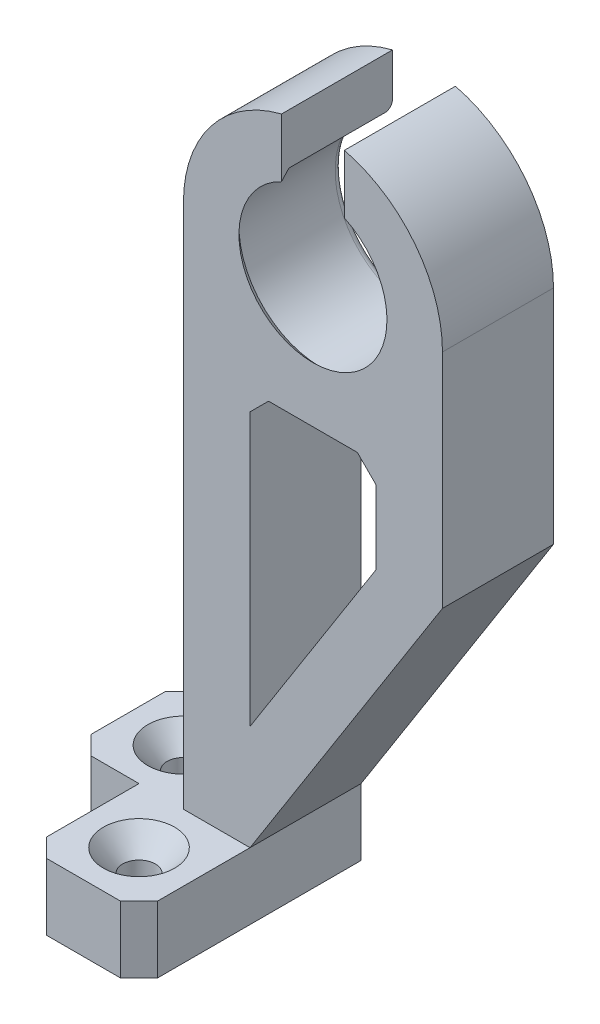
ISO-10303-21;
HEADER;
FILE_DESCRIPTION(('STEP AP214'),'2;1');
FILE_NAME('part.step','',(''),(''),'','','');
FILE_SCHEMA(('AUTOMOTIVE_DESIGN { 1 0 10303 214 1 1 1 1 }'));
ENDSEC;
DATA;
#1=APPLICATION_CONTEXT('core data for automotive mechanical design processes');
#2=APPLICATION_PROTOCOL_DEFINITION('international standard','automotive_design',2000,#1);
#3=PRODUCT_CONTEXT('',#1,'mechanical');
#4=PRODUCT('Part','Part','',(#3));
#5=PRODUCT_RELATED_PRODUCT_CATEGORY('part','',(#4));
#6=PRODUCT_DEFINITION_FORMATION('','',#4);
#7=PRODUCT_DEFINITION_CONTEXT('part definition',#1,'design');
#8=PRODUCT_DEFINITION('design','',#6,#7);
#9=PRODUCT_DEFINITION_SHAPE('','',#8);
#10=(LENGTH_UNIT() NAMED_UNIT(*) SI_UNIT(.MILLI.,.METRE.));
#11=(NAMED_UNIT(*) PLANE_ANGLE_UNIT() SI_UNIT($,.RADIAN.));
#12=(NAMED_UNIT(*) SI_UNIT($,.STERADIAN.) SOLID_ANGLE_UNIT());
#13=UNCERTAINTY_MEASURE_WITH_UNIT(LENGTH_MEASURE(1.E-05),#10,'distance_accuracy_value','');
#14=(GEOMETRIC_REPRESENTATION_CONTEXT(3) GLOBAL_UNCERTAINTY_ASSIGNED_CONTEXT((#13)) GLOBAL_UNIT_ASSIGNED_CONTEXT((#10,
#11,#12)) REPRESENTATION_CONTEXT('',''));
#15=CARTESIAN_POINT('',(0.,0.,0.));
#16=DIRECTION('',(0.,0.,1.));
#17=DIRECTION('',(1.,0.,0.));
#18=AXIS2_PLACEMENT_3D('',#15,#16,#17);
#19=CARTESIAN_POINT('',(0.,0.,15.));
#20=DIRECTION('',(0.,0.,1.));
#21=DIRECTION('',(1.,0.,0.));
#22=AXIS2_PLACEMENT_3D('',#19,#20,#21);
#23=PLANE('',#22);
#24=DIRECTION('',(-1.,0.,0.));
#25=VECTOR('',#24,1.);
#26=CARTESIAN_POINT('',(0.,-71.,15.));
#27=LINE('',#26,#25);
#28=CARTESIAN_POINT('',(-23.5,-71.,15.));
#29=VERTEX_POINT('',#28);
#30=CARTESIAN_POINT('',(-30.,-71.,15.));
#31=VERTEX_POINT('',#30);
#32=EDGE_CURVE('E241',#29,#31,#27,.T.);
#33=ORIENTED_EDGE('',*,*,#32,.T.);
#34=DIRECTION('',(0.,-1.,0.));
#35=VECTOR('',#34,1.);
#36=CARTESIAN_POINT('',(-30.,0.,15.));
#37=LINE('',#36,#35);
#38=CARTESIAN_POINT('',(-30.,-80.,15.));
#39=VERTEX_POINT('',#38);
#40=EDGE_CURVE('E484',#31,#39,#37,.T.);
#41=ORIENTED_EDGE('',*,*,#40,.T.);
#42=DIRECTION('',(1.,0.,0.));
#43=VECTOR('',#42,1.);
#44=CARTESIAN_POINT('',(0.,-80.,15.));
#45=LINE('',#44,#43);
#46=CARTESIAN_POINT('',(-23.5,-80.,15.));
#47=VERTEX_POINT('',#46);
#48=EDGE_CURVE('E247',#39,#47,#45,.T.);
#49=ORIENTED_EDGE('',*,*,#48,.T.);
#50=DIRECTION('',(0.,-1.,0.));
#51=VECTOR('',#50,1.);
#52=CARTESIAN_POINT('',(-23.5,-71.,15.));
#53=LINE('',#52,#51);
#54=EDGE_CURVE('E232',#29,#47,#53,.T.);
#55=ORIENTED_EDGE('',*,*,#54,.F.);
#56=EDGE_LOOP('',(#33,#41,#49,#55));
#57=FACE_BOUND('',#56,.T.);
#58=ADVANCED_FACE('F42',(#57),#23,.T.);
#59=CARTESIAN_POINT('',(0.,0.,15.));
#60=DIRECTION('',(0.,0.,-1.));
#61=DIRECTION('',(-1.,0.,0.));
#62=AXIS2_PLACEMENT_3D('',#59,#60,#61);
#63=CYLINDRICAL_SURFACE('',#62,11.);
#64=DIRECTION('',(0.,0.,-1.));
#65=VECTOR('',#64,1.);
#66=CARTESIAN_POINT('',(4.25,10.1458119438515,15.));
#67=LINE('',#66,#65);
#68=CARTESIAN_POINT('',(4.25,10.1458119438515,14.));
#69=VERTEX_POINT('',#68);
#70=CARTESIAN_POINT('',(4.25,10.1458119438515,1.));
#71=VERTEX_POINT('',#70);
#72=EDGE_CURVE('E362',#69,#71,#67,.T.);
#73=ORIENTED_EDGE('',*,*,#72,.T.);
#74=CARTESIAN_POINT('',(0.,0.,1.));
#75=DIRECTION('',(0.,0.,1.));
#76=DIRECTION('',(1.,0.,0.));
#77=AXIS2_PLACEMENT_3D('',#74,#75,#76);
#78=CIRCLE('',#77,11.);
#79=CARTESIAN_POINT('',(-4.25,10.1458119438515,1.));
#80=VERTEX_POINT('',#79);
#81=EDGE_CURVE('E381',#71,#80,#78,.F.);
#82=ORIENTED_EDGE('',*,*,#81,.T.);
#83=DIRECTION('',(0.,0.,-1.));
#84=VECTOR('',#83,1.);
#85=CARTESIAN_POINT('',(-4.25,10.1458119438515,15.));
#86=LINE('',#85,#84);
#87=CARTESIAN_POINT('',(-4.25,10.1458119438515,14.));
#88=VERTEX_POINT('',#87);
#89=EDGE_CURVE('E359',#88,#80,#86,.T.);
#90=ORIENTED_EDGE('',*,*,#89,.F.);
#91=CARTESIAN_POINT('',(0.,0.,14.));
#92=DIRECTION('',(0.,0.,1.));
#93=DIRECTION('',(1.,0.,0.));
#94=AXIS2_PLACEMENT_3D('',#91,#92,#93);
#95=CIRCLE('',#94,11.);
#96=EDGE_CURVE('E268',#69,#88,#95,.F.);
#97=ORIENTED_EDGE('',*,*,#96,.F.);
#98=EDGE_LOOP('',(#73,#82,#90,#97));
#99=FACE_BOUND('',#98,.T.);
#100=ADVANCED_FACE('F395',(#99),#63,.F.);
#101=CARTESIAN_POINT('',(0.,-17.5,15.));
#102=DIRECTION('',(0.,1.,0.));
#103=DIRECTION('',(0.,0.,1.));
#104=AXIS2_PLACEMENT_3D('',#101,#102,#103);
#105=PLANE('',#104);
#106=DIRECTION('',(1.,0.,0.));
#107=VECTOR('',#106,1.);
#108=CARTESIAN_POINT('',(0.,-17.5,0.));
#109=LINE('',#108,#107);
#110=CARTESIAN_POINT('',(-5.99999999999998,-17.5,0.));
#111=VERTEX_POINT('',#110);
#112=CARTESIAN_POINT('',(6.00000000000002,-17.5,0.));
#113=VERTEX_POINT('',#112);
#114=EDGE_CURVE('E328',#111,#113,#109,.T.);
#115=ORIENTED_EDGE('',*,*,#114,.T.);
#116=DIRECTION('',(0.,0.,1.));
#117=VECTOR('',#116,1.);
#118=CARTESIAN_POINT('',(6.00000000000002,-17.5,15.));
#119=LINE('',#118,#117);
#120=CARTESIAN_POINT('',(6.00000000000002,-17.5,15.));
#121=VERTEX_POINT('',#120);
#122=EDGE_CURVE('E72',#113,#121,#119,.T.);
#123=ORIENTED_EDGE('',*,*,#122,.T.);
#124=DIRECTION('',(1.,0.,0.));
#125=VECTOR('',#124,1.);
#126=CARTESIAN_POINT('',(0.,-17.5,15.));
#127=LINE('',#126,#125);
#128=CARTESIAN_POINT('',(-5.99999999999998,-17.5,15.));
#129=VERTEX_POINT('',#128);
#130=EDGE_CURVE('E292',#129,#121,#127,.T.);
#131=ORIENTED_EDGE('',*,*,#130,.F.);
#132=DIRECTION('',(0.,0.,-1.));
#133=VECTOR('',#132,1.);
#134=CARTESIAN_POINT('',(-5.99999999999998,-17.5,15.));
#135=LINE('',#134,#133);
#136=EDGE_CURVE('E449',#129,#111,#135,.T.);
#137=ORIENTED_EDGE('',*,*,#136,.T.);
#138=EDGE_LOOP('',(#115,#123,#131,#137));
#139=FACE_BOUND('',#138,.T.);
#140=ADVANCED_FACE('F421',(#139),#105,.F.);
#141=CARTESIAN_POINT('',(8.5,0.,15.));
#142=DIRECTION('',(1.,0.,0.));
#143=DIRECTION('',(0.,1.,0.));
#144=AXIS2_PLACEMENT_3D('',#141,#142,#143);
#145=PLANE('',#144);
#146=DIRECTION('',(0.,-1.,0.));
#147=VECTOR('',#146,1.);
#148=CARTESIAN_POINT('',(8.5,0.,15.));
#149=LINE('',#148,#147);
#150=CARTESIAN_POINT('',(8.5,-20.,15.));
#151=VERTEX_POINT('',#150);
#152=CARTESIAN_POINT('',(8.50000000000001,-30.,15.));
#153=VERTEX_POINT('',#152);
#154=EDGE_CURVE('E298',#151,#153,#149,.T.);
#155=ORIENTED_EDGE('',*,*,#154,.F.);
#156=DIRECTION('',(0.,0.,-1.));
#157=VECTOR('',#156,1.);
#158=CARTESIAN_POINT('',(8.5,-20.,0.));
#159=LINE('',#158,#157);
#160=CARTESIAN_POINT('',(8.5,-20.,0.));
#161=VERTEX_POINT('',#160);
#162=EDGE_CURVE('E506',#151,#161,#159,.T.);
#163=ORIENTED_EDGE('',*,*,#162,.T.);
#164=DIRECTION('',(0.,-1.,0.));
#165=VECTOR('',#164,1.);
#166=CARTESIAN_POINT('',(8.5,0.,0.));
#167=LINE('',#166,#165);
#168=CARTESIAN_POINT('',(8.50000000000001,-30.,0.));
#169=VERTEX_POINT('',#168);
#170=EDGE_CURVE('E330',#161,#169,#167,.T.);
#171=ORIENTED_EDGE('',*,*,#170,.T.);
#172=DIRECTION('',(0.,0.,-1.));
#173=VECTOR('',#172,1.);
#174=CARTESIAN_POINT('',(8.50000000000001,-30.,15.));
#175=LINE('',#174,#173);
#176=EDGE_CURVE('E338',#153,#169,#175,.T.);
#177=ORIENTED_EDGE('',*,*,#176,.F.);
#178=EDGE_LOOP('',(#155,#163,#171,#177));
#179=FACE_BOUND('',#178,.T.);
#180=ADVANCED_FACE('F411',(#179),#145,.F.);
#181=CARTESIAN_POINT('',(19.6302503182011,-12.4484514212983,15.));
#182=DIRECTION('',(0.844508578449678,-0.535542025358332,0.));
#183=DIRECTION('',(0.535542025358332,0.844508578449678,0.));
#184=AXIS2_PLACEMENT_3D('',#181,#182,#183);
#185=PLANE('',#184);
#186=DIRECTION('',(-0.535542025358332,-0.844508578449678,0.));
#187=VECTOR('',#186,1.);
#188=CARTESIAN_POINT('',(19.6302503182011,-12.4484514212983,0.));
#189=LINE('',#188,#187);
#190=CARTESIAN_POINT('',(-8.5,-56.8076923076923,0.));
#191=VERTEX_POINT('',#190);
#192=EDGE_CURVE('E332',#169,#191,#189,.T.);
#193=ORIENTED_EDGE('',*,*,#192,.T.);
#194=DIRECTION('',(0.,0.,-1.));
#195=VECTOR('',#194,1.);
#196=CARTESIAN_POINT('',(-8.5,-56.8076923076923,15.));
#197=LINE('',#196,#195);
#198=CARTESIAN_POINT('',(-8.5,-56.8076923076923,15.));
#199=VERTEX_POINT('',#198);
#200=EDGE_CURVE('E335',#199,#191,#197,.T.);
#201=ORIENTED_EDGE('',*,*,#200,.F.);
#202=DIRECTION('',(-0.535542025358332,-0.844508578449678,0.));
#203=VECTOR('',#202,1.);
#204=CARTESIAN_POINT('',(19.6302503182011,-12.4484514212983,15.));
#205=LINE('',#204,#203);
#206=EDGE_CURVE('E296',#153,#199,#205,.T.);
#207=ORIENTED_EDGE('',*,*,#206,.F.);
#208=ORIENTED_EDGE('',*,*,#176,.T.);
#209=EDGE_LOOP('',(#193,#201,#207,#208));
#210=FACE_BOUND('',#209,.T.);
#211=ADVANCED_FACE('F406',(#210),#185,.F.);
#212=CARTESIAN_POINT('',(26.049002969877,-16.5188799321171,15.));
#213=DIRECTION('',(0.844508578449678,-0.535542025358332,0.));
#214=DIRECTION('',(0.535542025358332,0.844508578449678,0.));
#215=AXIS2_PLACEMENT_3D('',#212,#213,#214);
#216=PLANE('',#215);
#217=DIRECTION('',(-0.535542025358332,-0.844508578449678,0.));
#218=VECTOR('',#217,1.);
#219=CARTESIAN_POINT('',(26.049002969877,-16.5188799321171,0.));
#220=LINE('',#219,#218);
#221=CARTESIAN_POINT('',(17.5,-30.,0.));
#222=VERTEX_POINT('',#221);
#223=CARTESIAN_POINT('',(-8.5,-71.,0.));
#224=VERTEX_POINT('',#223);
#225=EDGE_CURVE('E271',#222,#224,#220,.T.);
#226=ORIENTED_EDGE('',*,*,#225,.F.);
#227=DIRECTION('',(0.,0.,-1.));
#228=VECTOR('',#227,1.);
#229=CARTESIAN_POINT('',(17.5,-30.,15.));
#230=LINE('',#229,#228);
#231=CARTESIAN_POINT('',(17.5,-30.,15.));
#232=VERTEX_POINT('',#231);
#233=EDGE_CURVE('E339',#232,#222,#230,.T.);
#234=ORIENTED_EDGE('',*,*,#233,.F.);
#235=DIRECTION('',(-0.535542025358332,-0.844508578449678,0.));
#236=VECTOR('',#235,1.);
#237=CARTESIAN_POINT('',(26.049002969877,-16.5188799321171,15.));
#238=LINE('',#237,#236);
#239=CARTESIAN_POINT('',(-8.5,-71.,15.));
#240=VERTEX_POINT('',#239);
#241=EDGE_CURVE('E274',#232,#240,#238,.T.);
#242=ORIENTED_EDGE('',*,*,#241,.T.);
#243=DIRECTION('',(0.,0.,-1.));
#244=VECTOR('',#243,1.);
#245=CARTESIAN_POINT('',(-8.5,-71.,15.));
#246=LINE('',#245,#244);
#247=EDGE_CURVE('E295',#240,#224,#246,.T.);
#248=ORIENTED_EDGE('',*,*,#247,.T.);
#249=EDGE_LOOP('',(#226,#234,#242,#248));
#250=FACE_BOUND('',#249,.T.);
#251=ADVANCED_FACE('F403',(#250),#216,.T.);
#252=CARTESIAN_POINT('',(17.5,0.,15.));
#253=DIRECTION('',(-1.,0.,0.));
#254=DIRECTION('',(0.,0.,1.));
#255=AXIS2_PLACEMENT_3D('',#252,#253,#254);
#256=PLANE('',#255);
#257=DIRECTION('',(0.,1.,0.));
#258=VECTOR('',#257,1.);
#259=CARTESIAN_POINT('',(17.5,0.,0.));
#260=LINE('',#259,#258);
#261=CARTESIAN_POINT('',(17.5,0.,0.));
#262=VERTEX_POINT('',#261);
#263=EDGE_CURVE('E304',#222,#262,#260,.T.);
#264=ORIENTED_EDGE('',*,*,#263,.T.);
#265=DIRECTION('',(0.,0.,-1.));
#266=VECTOR('',#265,1.);
#267=CARTESIAN_POINT('',(17.5,0.,15.));
#268=LINE('',#267,#266);
#269=CARTESIAN_POINT('',(17.5,0.,15.));
#270=VERTEX_POINT('',#269);
#271=EDGE_CURVE('E368',#270,#262,#268,.T.);
#272=ORIENTED_EDGE('',*,*,#271,.F.);
#273=DIRECTION('',(0.,1.,0.));
#274=VECTOR('',#273,1.);
#275=CARTESIAN_POINT('',(17.5,0.,15.));
#276=LINE('',#275,#274);
#277=EDGE_CURVE('E277',#232,#270,#276,.T.);
#278=ORIENTED_EDGE('',*,*,#277,.F.);
#279=ORIENTED_EDGE('',*,*,#233,.T.);
#280=EDGE_LOOP('',(#264,#272,#278,#279));
#281=FACE_BOUND('',#280,.T.);
#282=ADVANCED_FACE('F400',(#281),#256,.F.);
#283=CARTESIAN_POINT('',(0.,0.,15.));
#284=DIRECTION('',(0.,0.,-1.));
#285=DIRECTION('',(-1.,0.,0.));
#286=AXIS2_PLACEMENT_3D('',#283,#284,#285);
#287=CYLINDRICAL_SURFACE('',#286,17.5);
#288=CARTESIAN_POINT('',(0.,0.,0.));
#289=DIRECTION('',(0.,0.,1.));
#290=DIRECTION('',(1.,0.,0.));
#291=AXIS2_PLACEMENT_3D('',#288,#289,#290);
#292=CIRCLE('',#291,17.5);
#293=CARTESIAN_POINT('',(4.25,16.976086121365,0.));
#294=VERTEX_POINT('',#293);
#295=EDGE_CURVE('E306',#262,#294,#292,.T.);
#296=ORIENTED_EDGE('',*,*,#295,.T.);
#297=DIRECTION('',(0.,0.,-1.));
#298=VECTOR('',#297,1.);
#299=CARTESIAN_POINT('',(4.25,16.976086121365,15.));
#300=LINE('',#299,#298);
#301=CARTESIAN_POINT('',(4.25,16.976086121365,15.));
#302=VERTEX_POINT('',#301);
#303=EDGE_CURVE('E365',#302,#294,#300,.T.);
#304=ORIENTED_EDGE('',*,*,#303,.F.);
#305=CARTESIAN_POINT('',(0.,0.,15.));
#306=DIRECTION('',(0.,0.,1.));
#307=DIRECTION('',(1.,0.,0.));
#308=AXIS2_PLACEMENT_3D('',#305,#306,#307);
#309=CIRCLE('',#308,17.5);
#310=EDGE_CURVE('E280',#270,#302,#309,.T.);
#311=ORIENTED_EDGE('',*,*,#310,.F.);
#312=ORIENTED_EDGE('',*,*,#271,.T.);
#313=EDGE_LOOP('',(#296,#304,#311,#312));
#314=FACE_BOUND('',#313,.T.);
#315=ADVANCED_FACE('F393',(#314),#287,.T.);
#316=CARTESIAN_POINT('',(4.25,0.,15.));
#317=DIRECTION('',(1.,0.,0.));
#318=DIRECTION('',(0.,0.,-1.));
#319=AXIS2_PLACEMENT_3D('',#316,#317,#318);
#320=PLANE('',#319);
#321=ORIENTED_EDGE('',*,*,#72,.F.);
#322=CARTESIAN_POINT('',(4.25,10.1458119438515,14.));
#323=CARTESIAN_POINT('',(4.25,10.055024848562,14.0837367153228));
#324=CARTESIAN_POINT('',(4.25,9.96415454917259,14.1673832860833));
#325=CARTESIAN_POINT('',(4.25,9.78223449250508,14.3344800461725));
#326=CARTESIAN_POINT('',(4.25,9.69118473620542,14.4179302365664));
#327=CARTESIAN_POINT('',(4.25,9.50889166265249,14.584619115272));
#328=CARTESIAN_POINT('',(4.25,9.41764834525821,14.6678578034295));
#329=CARTESIAN_POINT('',(4.25,9.23495200516229,14.8341057093318));
#330=CARTESIAN_POINT('',(4.25,9.14349898132284,14.9171149258262));
#331=CARTESIAN_POINT('',(4.25,9.05193349511583,15.));
#332=B_SPLINE_CURVE_WITH_KNOTS('',3,(#322,#323,#324,#325,#326,#327,#328,#329,#330,#331),
.UNSPECIFIED.,.F.,.F.,(4,2,2,2,4),(0.,0.370522886220325,0.741043757848983,1.11156489949459,
1.48208805623486),.UNSPECIFIED.);
#333=CARTESIAN_POINT('',(4.25,9.05193349511583,15.));
#334=VERTEX_POINT('',#333);
#335=EDGE_CURVE('E11',#69,#334,#332,.T.);
#336=ORIENTED_EDGE('',*,*,#335,.T.);
#337=DIRECTION('',(0.,-1.,0.));
#338=VECTOR('',#337,1.);
#339=CARTESIAN_POINT('',(4.25,0.,15.));
#340=LINE('',#339,#338);
#341=EDGE_CURVE('E282',#302,#334,#340,.T.);
#342=ORIENTED_EDGE('',*,*,#341,.F.);
#343=ORIENTED_EDGE('',*,*,#303,.T.);
#344=DIRECTION('',(0.,-1.,0.));
#345=VECTOR('',#344,1.);
#346=CARTESIAN_POINT('',(4.25,0.,0.));
#347=LINE('',#346,#345);
#348=CARTESIAN_POINT('',(4.25,11.2221878437317,0.));
#349=VERTEX_POINT('',#348);
#350=EDGE_CURVE('E308',#294,#349,#347,.T.);
#351=ORIENTED_EDGE('',*,*,#350,.T.);
#352=CARTESIAN_POINT('',(4.25,11.2221878437317,0.));
#353=CARTESIAN_POINT('',(4.25,11.1583395817592,-3.0000049319474E-05));
#354=CARTESIAN_POINT('',(4.25,11.0944916848489,0.00534684254006916));
#355=CARTESIAN_POINT('',(4.25,10.9685051190463,0.0266415869899688));
#356=CARTESIAN_POINT('',(4.25,10.9063684507458,0.0425713231365217));
#357=CARTESIAN_POINT('',(4.25,10.7856097346543,0.0847170694115298));
#358=CARTESIAN_POINT('',(4.25,10.7269909146085,0.110942364604347));
#359=CARTESIAN_POINT('',(4.25,10.6151941753337,0.173137249708884));
#360=CARTESIAN_POINT('',(4.25,10.5620129248735,0.209100823760954));
#361=CARTESIAN_POINT('',(4.25,10.4644221812902,0.288782010833055));
#362=CARTESIAN_POINT('',(4.25,10.4197984155315,0.332236437308677));
#363=CARTESIAN_POINT('',(4.25,10.3391494373158,0.42654341846053));
#364=CARTESIAN_POINT('',(4.25,10.303123297967,0.477395174694179));
#365=CARTESIAN_POINT('',(4.25,10.2435174342038,0.581159894120742));
#366=CARTESIAN_POINT('',(4.25,10.2192355092847,0.633670025049938));
#367=CARTESIAN_POINT('',(4.25,10.1806360078176,0.74219108724674));
#368=CARTESIAN_POINT('',(4.25,10.1663003344697,0.798195457377362));
#369=CARTESIAN_POINT('',(4.25,10.1534588676889,0.878965390171643));
#370=CARTESIAN_POINT('',(4.25,10.1505922030188,0.903100579551488));
#371=CARTESIAN_POINT('',(4.25,10.1467704706926,0.951486110929542));
#372=CARTESIAN_POINT('',(4.25,10.1458125993548,0.97573623151643));
#373=CARTESIAN_POINT('',(4.25,10.1458119438515,1.));
#374=B_SPLINE_CURVE_WITH_KNOTS('',3,(#352,#353,#354,#355,#356,#357,#358,#359,#360,#361,#362,
#363,#364,#365,#366,#367,#368,#369,#370,#371,#372,#373),.UNSPECIFIED.,.F.,.F.,(4,2,2,2,2,2,2,2,
2,2,4),(0.,0.191323292335232,0.38286150355206,0.574572852067377,0.766166039274555,
0.95204628292609,1.13790647816349,1.31056773911045,1.48291402022096,1.55576652511065,
1.62851194337912),.UNSPECIFIED.);
#375=EDGE_CURVE('E374',#349,#71,#374,.T.);
#376=ORIENTED_EDGE('',*,*,#375,.T.);
#377=EDGE_LOOP('',(#321,#336,#342,#343,#351,#376));
#378=FACE_BOUND('',#377,.T.);
#379=ADVANCED_FACE('F387',(#378),#320,.F.);
#380=CARTESIAN_POINT('',(-4.25,0.,15.));
#381=DIRECTION('',(-1.,0.,0.));
#382=DIRECTION('',(0.,0.,1.));
#383=AXIS2_PLACEMENT_3D('',#380,#381,#382);
#384=PLANE('',#383);
#385=DIRECTION('',(0.,1.,0.));
#386=VECTOR('',#385,1.);
#387=CARTESIAN_POINT('',(-4.25,0.,15.));
#388=LINE('',#387,#386);
#389=CARTESIAN_POINT('',(-4.25,9.05193349511583,15.));
#390=VERTEX_POINT('',#389);
#391=CARTESIAN_POINT('',(-4.25,16.976086121365,15.));
#392=VERTEX_POINT('',#391);
#393=EDGE_CURVE('E285',#390,#392,#388,.T.);
#394=ORIENTED_EDGE('',*,*,#393,.F.);
#395=CARTESIAN_POINT('',(-4.25,9.05193349511583,15.));
#396=CARTESIAN_POINT('',(-4.25,9.14349898132284,14.9171149258262));
#397=CARTESIAN_POINT('',(-4.25,9.23495200516229,14.8341057093318));
#398=CARTESIAN_POINT('',(-4.25,9.41764834525821,14.6678578034295));
#399=CARTESIAN_POINT('',(-4.25,9.50889166265249,14.584619115272));
#400=CARTESIAN_POINT('',(-4.25,9.69118473620542,14.4179302365664));
#401=CARTESIAN_POINT('',(-4.25,9.78223449250508,14.3344800461725));
#402=CARTESIAN_POINT('',(-4.25,9.96415454917259,14.1673832860833));
#403=CARTESIAN_POINT('',(-4.25,10.055024848562,14.0837367153228));
#404=CARTESIAN_POINT('',(-4.25,10.1458119438515,14.));
#405=B_SPLINE_CURVE_WITH_KNOTS('',3,(#395,#396,#397,#398,#399,#400,#401,#402,#403,#404),
.UNSPECIFIED.,.F.,.F.,(4,2,2,2,4),(0.,0.370523156740273,0.741044298385878,1.11156517001453,
1.48208805623486),.UNSPECIFIED.);
#406=EDGE_CURVE('E57',#390,#88,#405,.T.);
#407=ORIENTED_EDGE('',*,*,#406,.T.);
#408=ORIENTED_EDGE('',*,*,#89,.T.);
#409=CARTESIAN_POINT('',(-4.25,10.1458119438515,1.));
#410=CARTESIAN_POINT('',(-4.25,10.1458108735423,0.973395576400315));
#411=CARTESIAN_POINT('',(-4.25,10.1469638395564,0.946804559012869));
#412=CARTESIAN_POINT('',(-4.25,10.1515550450408,0.893826357710576));
#413=CARTESIAN_POINT('',(-4.25,10.1549927799568,0.867439130093268));
#414=CARTESIAN_POINT('',(-4.25,10.1686647813517,0.789031282276641));
#415=CARTESIAN_POINT('',(-4.25,10.1822582471187,0.737558464762993));
#416=CARTESIAN_POINT('',(-4.25,10.2178399264313,0.637666094587101));
#417=CARTESIAN_POINT('',(-4.25,10.2398252128011,0.589245484129616));
#418=CARTESIAN_POINT('',(-4.25,10.2913577962062,0.496593616682435));
#419=CARTESIAN_POINT('',(-4.25,10.3209086455735,0.452364341094024));
#420=CARTESIAN_POINT('',(-4.25,10.3876735395218,0.367680586041679));
#421=CARTESIAN_POINT('',(-4.25,10.4251127640972,0.327404133332133));
#422=CARTESIAN_POINT('',(-4.25,10.5058087766385,0.253183594946056));
#423=CARTESIAN_POINT('',(-4.25,10.5490672219816,0.219241319910768));
#424=CARTESIAN_POINT('',(-4.25,10.6435354111256,0.156048050417647));
#425=CARTESIAN_POINT('',(-4.25,10.6950950676092,0.127320351534621));
#426=CARTESIAN_POINT('',(-4.25,10.8020978120165,0.0783315984001153));
#427=CARTESIAN_POINT('',(-4.25,10.8575419796582,0.0580729091378657));
#428=CARTESIAN_POINT('',(-4.25,10.9642934360648,0.02821218700798));
#429=CARTESIAN_POINT('',(-4.25,11.0153342651279,0.0176463912123784));
#430=CARTESIAN_POINT('',(-4.25,11.1183104469153,0.00353938132545975));
#431=CARTESIAN_POINT('',(-4.25,11.1702445593202,-1.08867587109036E-05));
#432=CARTESIAN_POINT('',(-4.25,11.2221878437317,0.));
#433=B_SPLINE_CURVE_WITH_KNOTS('',3,(#409,#410,#411,#412,#413,#414,#415,#416,#417,#418,#419,
#420,#421,#422,#423,#424,#425,#426,#427,#428,#429,#430,#431,#432),.UNSPECIFIED.,.F.,.F.,(4,2,2,
2,2,2,2,2,2,2,2,4),(0.,0.0797620160480001,0.159506423794101,0.318385351247416,0.477208910240669,
0.636107180401895,0.800374082640462,0.964687869316413,1.14099577393669,1.31735288008472,
1.47324688540963,1.62893956768402),.UNSPECIFIED.);
#434=CARTESIAN_POINT('',(-4.25,11.2221878437317,0.));
#435=VERTEX_POINT('',#434);
#436=EDGE_CURVE('E466',#80,#435,#433,.T.);
#437=ORIENTED_EDGE('',*,*,#436,.T.);
#438=DIRECTION('',(0.,1.,0.));
#439=VECTOR('',#438,1.);
#440=CARTESIAN_POINT('',(-4.25,0.,0.));
#441=LINE('',#440,#439);
#442=CARTESIAN_POINT('',(-4.25,16.976086121365,0.));
#443=VERTEX_POINT('',#442);
#444=EDGE_CURVE('E311',#435,#443,#441,.T.);
#445=ORIENTED_EDGE('',*,*,#444,.T.);
#446=DIRECTION('',(0.,0.,-1.));
#447=VECTOR('',#446,1.);
#448=CARTESIAN_POINT('',(-4.25,16.976086121365,15.));
#449=LINE('',#448,#447);
#450=EDGE_CURVE('E356',#392,#443,#449,.T.);
#451=ORIENTED_EDGE('',*,*,#450,.F.);
#452=EDGE_LOOP('',(#394,#407,#408,#437,#445,#451));
#453=FACE_BOUND('',#452,.T.);
#454=ADVANCED_FACE('F392',(#453),#384,.F.);
#455=CARTESIAN_POINT('',(0.,0.,15.));
#456=DIRECTION('',(0.,0.,-1.));
#457=DIRECTION('',(-1.,0.,0.));
#458=AXIS2_PLACEMENT_3D('',#455,#456,#457);
#459=CYLINDRICAL_SURFACE('',#458,17.5);
#460=CARTESIAN_POINT('',(0.,0.,0.));
#461=DIRECTION('',(0.,0.,1.));
#462=DIRECTION('',(1.,0.,0.));
#463=AXIS2_PLACEMENT_3D('',#460,#461,#462);
#464=CIRCLE('',#463,17.5);
#465=CARTESIAN_POINT('',(-17.5,0.,0.));
#466=VERTEX_POINT('',#465);
#467=EDGE_CURVE('E313',#443,#466,#464,.T.);
#468=ORIENTED_EDGE('',*,*,#467,.T.);
#469=DIRECTION('',(0.,0.,-1.));
#470=VECTOR('',#469,1.);
#471=CARTESIAN_POINT('',(-17.5,0.,15.));
#472=LINE('',#471,#470);
#473=CARTESIAN_POINT('',(-17.5,0.,15.));
#474=VERTEX_POINT('',#473);
#475=EDGE_CURVE('E354',#474,#466,#472,.T.);
#476=ORIENTED_EDGE('',*,*,#475,.F.);
#477=CARTESIAN_POINT('',(0.,0.,15.));
#478=DIRECTION('',(0.,0.,1.));
#479=DIRECTION('',(1.,0.,0.));
#480=AXIS2_PLACEMENT_3D('',#477,#478,#479);
#481=CIRCLE('',#480,17.5);
#482=EDGE_CURVE('E287',#392,#474,#481,.T.);
#483=ORIENTED_EDGE('',*,*,#482,.F.);
#484=ORIENTED_EDGE('',*,*,#450,.T.);
#485=EDGE_LOOP('',(#468,#476,#483,#484));
#486=FACE_BOUND('',#485,.T.);
#487=ADVANCED_FACE('F462',(#486),#459,.T.);
#488=CARTESIAN_POINT('',(-17.5,0.,15.));
#489=DIRECTION('',(-1.,0.,0.));
#490=DIRECTION('',(0.,0.,1.));
#491=AXIS2_PLACEMENT_3D('',#488,#489,#490);
#492=PLANE('',#491);
#493=DIRECTION('',(0.,1.,0.));
#494=VECTOR('',#493,1.);
#495=CARTESIAN_POINT('',(-17.5,0.,0.));
#496=LINE('',#495,#494);
#497=CARTESIAN_POINT('',(-17.5,-71.,0.));
#498=VERTEX_POINT('',#497);
#499=EDGE_CURVE('E316',#498,#466,#496,.T.);
#500=ORIENTED_EDGE('',*,*,#499,.F.);
#501=DIRECTION('',(0.,0.,-1.));
#502=VECTOR('',#501,1.);
#503=CARTESIAN_POINT('',(-17.5,-71.,15.));
#504=LINE('',#503,#502);
#505=CARTESIAN_POINT('',(-17.5,-71.,15.));
#506=VERTEX_POINT('',#505);
#507=EDGE_CURVE('E352',#506,#498,#504,.T.);
#508=ORIENTED_EDGE('',*,*,#507,.F.);
#509=DIRECTION('',(0.,1.,0.));
#510=VECTOR('',#509,1.);
#511=CARTESIAN_POINT('',(-17.5,0.,15.));
#512=LINE('',#511,#510);
#513=EDGE_CURVE('E248',#506,#474,#512,.T.);
#514=ORIENTED_EDGE('',*,*,#513,.T.);
#515=ORIENTED_EDGE('',*,*,#475,.T.);
#516=EDGE_LOOP('',(#500,#508,#514,#515));
#517=FACE_BOUND('',#516,.T.);
#518=ADVANCED_FACE('F540',(#517),#492,.T.);
#519=CARTESIAN_POINT('',(0.,-71.,15.));
#520=DIRECTION('',(0.,-1.,0.));
#521=DIRECTION('',(0.,0.,-1.));
#522=AXIS2_PLACEMENT_3D('',#519,#520,#521);
#523=PLANE('',#522);
#524=CARTESIAN_POINT('',(-16.,-71.,22.5));
#525=DIRECTION('',(0.,-1.,0.));
#526=DIRECTION('',(0.,0.,-1.));
#527=AXIS2_PLACEMENT_3D('',#524,#525,#526);
#528=CIRCLE('',#527,4.80786021344867);
#529=CARTESIAN_POINT('',(-16.,-71.,17.6921397865513));
#530=VERTEX_POINT('',#529);
#531=EDGE_CURVE('E578',#530,#530,#528,.T.);
#532=ORIENTED_EDGE('',*,*,#531,.T.);
#533=EDGE_LOOP('',(#532));
#534=FACE_BOUND('',#533,.T.);
#535=CARTESIAN_POINT('',(-25.,-71.,7.5));
#536=DIRECTION('',(0.,1.,0.));
#537=DIRECTION('',(0.,0.,1.));
#538=AXIS2_PLACEMENT_3D('',#535,#536,#537);
#539=CIRCLE('',#538,4.80786021344866);
#540=CARTESIAN_POINT('',(-25.,-71.,12.3078602134487));
#541=VERTEX_POINT('',#540);
#542=EDGE_CURVE('E253',#541,#541,#539,.T.);
#543=ORIENTED_EDGE('',*,*,#542,.F.);
#544=EDGE_LOOP('',(#543));
#545=FACE_BOUND('',#544,.T.);
#546=DIRECTION('',(0.,0.,-1.));
#547=VECTOR('',#546,1.);
#548=CARTESIAN_POINT('',(-32.5,-71.,15.));
#549=LINE('',#548,#547);
#550=CARTESIAN_POINT('',(-32.5,-71.,12.5));
#551=VERTEX_POINT('',#550);
#552=CARTESIAN_POINT('',(-32.5,-71.,2.50000000000002));
#553=VERTEX_POINT('',#552);
#554=EDGE_CURVE('E349',#551,#553,#549,.T.);
#555=ORIENTED_EDGE('',*,*,#554,.F.);
#556=DIRECTION('',(-0.707106781186549,0.,-0.707106781186546));
#557=VECTOR('',#556,1.);
#558=CARTESIAN_POINT('',(-32.5,-71.,12.5));
#559=LINE('',#558,#557);
#560=EDGE_CURVE('E244',#551,#31,#559,.F.);
#561=ORIENTED_EDGE('',*,*,#560,.T.);
#562=ORIENTED_EDGE('',*,*,#32,.F.);
#563=DIRECTION('',(0.,0.,-1.));
#564=VECTOR('',#563,1.);
#565=CARTESIAN_POINT('',(-23.5,-71.,30.));
#566=LINE('',#565,#564);
#567=CARTESIAN_POINT('',(-23.5,-71.,27.5));
#568=VERTEX_POINT('',#567);
#569=EDGE_CURVE('E227',#568,#29,#566,.T.);
#570=ORIENTED_EDGE('',*,*,#569,.F.);
#571=DIRECTION('',(0.707106781186546,0.,0.707106781186549));
#572=VECTOR('',#571,1.);
#573=CARTESIAN_POINT('',(-21.,-71.,30.));
#574=LINE('',#573,#572);
#575=CARTESIAN_POINT('',(-21.,-71.,30.));
#576=VERTEX_POINT('',#575);
#577=EDGE_CURVE('E477',#568,#576,#574,.T.);
#578=ORIENTED_EDGE('',*,*,#577,.T.);
#579=DIRECTION('',(-1.,0.,0.));
#580=VECTOR('',#579,1.);
#581=CARTESIAN_POINT('',(-23.5,-71.,30.));
#582=LINE('',#581,#580);
#583=CARTESIAN_POINT('',(-11.,-71.,30.));
#584=VERTEX_POINT('',#583);
#585=EDGE_CURVE('E238',#584,#576,#582,.T.);
#586=ORIENTED_EDGE('',*,*,#585,.F.);
#587=DIRECTION('',(-0.707106781186546,0.,0.707106781186549));
#588=VECTOR('',#587,1.);
#589=CARTESIAN_POINT('',(-11.,-71.,30.));
#590=LINE('',#589,#588);
#591=CARTESIAN_POINT('',(-8.49999999999999,-71.,27.5));
#592=VERTEX_POINT('',#591);
#593=EDGE_CURVE('E479',#584,#592,#590,.F.);
#594=ORIENTED_EDGE('',*,*,#593,.T.);
#595=DIRECTION('',(0.,0.,-1.));
#596=VECTOR('',#595,1.);
#597=CARTESIAN_POINT('',(-8.49999999999999,-71.,30.));
#598=LINE('',#597,#596);
#599=EDGE_CURVE('E237',#592,#240,#598,.T.);
#600=ORIENTED_EDGE('',*,*,#599,.T.);
#601=DIRECTION('',(-1.,0.,0.));
#602=VECTOR('',#601,1.);
#603=CARTESIAN_POINT('',(-23.5,-71.,15.));
#604=LINE('',#603,#602);
#605=EDGE_CURVE('E252',#240,#506,#604,.T.);
#606=ORIENTED_EDGE('',*,*,#605,.T.);
#607=ORIENTED_EDGE('',*,*,#507,.T.);
#608=DIRECTION('',(-1.,0.,0.));
#609=VECTOR('',#608,1.);
#610=CARTESIAN_POINT('',(0.,-71.,0.));
#611=LINE('',#610,#609);
#612=CARTESIAN_POINT('',(-30.,-71.,0.));
#613=VERTEX_POINT('',#612);
#614=EDGE_CURVE('E319',#498,#613,#611,.T.);
#615=ORIENTED_EDGE('',*,*,#614,.T.);
#616=DIRECTION('',(-0.707106781186546,0.,0.707106781186549));
#617=VECTOR('',#616,1.);
#618=CARTESIAN_POINT('',(-30.,-71.,0.));
#619=LINE('',#618,#617);
#620=EDGE_CURVE('E481',#613,#553,#619,.T.);
#621=ORIENTED_EDGE('',*,*,#620,.T.);
#622=EDGE_LOOP('',(#555,#561,#562,#570,#578,#586,#594,#600,#606,#607,#615,#621));
#623=FACE_BOUND('',#622,.T.);
#624=ADVANCED_FACE('F243',(#534,#545,#623),#523,.F.);
#625=CARTESIAN_POINT('',(-32.5,0.,15.));
#626=DIRECTION('',(-1.,0.,0.));
#627=DIRECTION('',(0.,0.,1.));
#628=AXIS2_PLACEMENT_3D('',#625,#626,#627);
#629=PLANE('',#628);
#630=DIRECTION('',(0.,0.,-1.));
#631=VECTOR('',#630,1.);
#632=CARTESIAN_POINT('',(-32.5,-80.,15.));
#633=LINE('',#632,#631);
#634=CARTESIAN_POINT('',(-32.5,-80.,12.5));
#635=VERTEX_POINT('',#634);
#636=CARTESIAN_POINT('',(-32.5,-80.,2.50000000000002));
#637=VERTEX_POINT('',#636);
#638=EDGE_CURVE('E346',#635,#637,#633,.T.);
#639=ORIENTED_EDGE('',*,*,#638,.F.);
#640=DIRECTION('',(0.,1.,0.));
#641=VECTOR('',#640,1.);
#642=CARTESIAN_POINT('',(-32.5,0.,12.5));
#643=LINE('',#642,#641);
#644=EDGE_CURVE('E474',#635,#551,#643,.T.);
#645=ORIENTED_EDGE('',*,*,#644,.T.);
#646=ORIENTED_EDGE('',*,*,#554,.T.);
#647=DIRECTION('',(0.,-1.,0.));
#648=VECTOR('',#647,1.);
#649=CARTESIAN_POINT('',(-32.5,-80.,2.50000000000002));
#650=LINE('',#649,#648);
#651=EDGE_CURVE('E472',#553,#637,#650,.T.);
#652=ORIENTED_EDGE('',*,*,#651,.T.);
#653=EDGE_LOOP('',(#639,#645,#646,#652));
#654=FACE_BOUND('',#653,.T.);
#655=ADVANCED_FACE('F534',(#654),#629,.T.);
#656=CARTESIAN_POINT('',(0.,-80.,15.));
#657=DIRECTION('',(0.,1.,0.));
#658=DIRECTION('',(0.,0.,1.));
#659=AXIS2_PLACEMENT_3D('',#656,#657,#658);
#660=PLANE('',#659);
#661=CARTESIAN_POINT('',(-16.,-80.,22.5));
#662=DIRECTION('',(0.,-1.,0.));
#663=DIRECTION('',(0.,0.,-1.));
#664=AXIS2_PLACEMENT_3D('',#661,#662,#663);
#665=CIRCLE('',#664,2.2);
#666=CARTESIAN_POINT('',(-16.,-80.,20.3));
#667=VERTEX_POINT('',#666);
#668=EDGE_CURVE('E584',#667,#667,#665,.T.);
#669=ORIENTED_EDGE('',*,*,#668,.F.);
#670=EDGE_LOOP('',(#669));
#671=FACE_BOUND('',#670,.T.);
#672=CARTESIAN_POINT('',(-25.,-80.,7.5));
#673=DIRECTION('',(0.,1.,0.));
#674=DIRECTION('',(0.,0.,1.));
#675=AXIS2_PLACEMENT_3D('',#672,#673,#674);
#676=CIRCLE('',#675,2.2);
#677=CARTESIAN_POINT('',(-25.,-80.,9.7));
#678=VERTEX_POINT('',#677);
#679=EDGE_CURVE('E575',#678,#678,#676,.T.);
#680=ORIENTED_EDGE('',*,*,#679,.T.);
#681=EDGE_LOOP('',(#680));
#682=FACE_BOUND('',#681,.T.);
#683=ORIENTED_EDGE('',*,*,#48,.F.);
#684=DIRECTION('',(0.707106781186549,0.,0.707106781186546));
#685=VECTOR('',#684,1.);
#686=CARTESIAN_POINT('',(-32.5,-80.,12.5));
#687=LINE('',#686,#685);
#688=EDGE_CURVE('E492',#39,#635,#687,.F.);
#689=ORIENTED_EDGE('',*,*,#688,.T.);
#690=ORIENTED_EDGE('',*,*,#638,.T.);
#691=DIRECTION('',(0.707106781186546,0.,-0.707106781186549));
#692=VECTOR('',#691,1.);
#693=CARTESIAN_POINT('',(-30.,-80.,0.));
#694=LINE('',#693,#692);
#695=CARTESIAN_POINT('',(-30.,-80.,0.));
#696=VERTEX_POINT('',#695);
#697=EDGE_CURVE('E490',#637,#696,#694,.T.);
#698=ORIENTED_EDGE('',*,*,#697,.T.);
#699=DIRECTION('',(1.,0.,0.));
#700=VECTOR('',#699,1.);
#701=CARTESIAN_POINT('',(0.,-80.,0.));
#702=LINE('',#701,#700);
#703=CARTESIAN_POINT('',(-8.49999999999999,-80.,0.));
#704=VERTEX_POINT('',#703);
#705=EDGE_CURVE('E322',#696,#704,#702,.T.);
#706=ORIENTED_EDGE('',*,*,#705,.T.);
#707=DIRECTION('',(0.,0.,-1.));
#708=VECTOR('',#707,1.);
#709=CARTESIAN_POINT('',(-8.49999999999999,-80.,15.));
#710=LINE('',#709,#708);
#711=CARTESIAN_POINT('',(-8.49999999999999,-80.,27.5));
#712=VERTEX_POINT('',#711);
#713=EDGE_CURVE('E344',#712,#704,#710,.T.);
#714=ORIENTED_EDGE('',*,*,#713,.F.);
#715=DIRECTION('',(0.707106781186546,0.,-0.707106781186549));
#716=VECTOR('',#715,1.);
#717=CARTESIAN_POINT('',(-11.,-80.,30.));
#718=LINE('',#717,#716);
#719=CARTESIAN_POINT('',(-11.,-80.,30.));
#720=VERTEX_POINT('',#719);
#721=EDGE_CURVE('E488',#712,#720,#718,.F.);
#722=ORIENTED_EDGE('',*,*,#721,.T.);
#723=DIRECTION('',(1.,0.,0.));
#724=VECTOR('',#723,1.);
#725=CARTESIAN_POINT('',(-23.5,-80.,30.));
#726=LINE('',#725,#724);
#727=CARTESIAN_POINT('',(-21.,-80.,30.));
#728=VERTEX_POINT('',#727);
#729=EDGE_CURVE('E256',#728,#720,#726,.T.);
#730=ORIENTED_EDGE('',*,*,#729,.F.);
#731=DIRECTION('',(-0.707106781186546,0.,-0.707106781186549));
#732=VECTOR('',#731,1.);
#733=CARTESIAN_POINT('',(-21.,-80.,30.));
#734=LINE('',#733,#732);
#735=CARTESIAN_POINT('',(-23.5,-80.,27.5));
#736=VERTEX_POINT('',#735);
#737=EDGE_CURVE('E486',#728,#736,#734,.T.);
#738=ORIENTED_EDGE('',*,*,#737,.T.);
#739=DIRECTION('',(0.,0.,-1.));
#740=VECTOR('',#739,1.);
#741=CARTESIAN_POINT('',(-23.5,-80.,30.));
#742=LINE('',#741,#740);
#743=EDGE_CURVE('E265',#736,#47,#742,.T.);
#744=ORIENTED_EDGE('',*,*,#743,.T.);
#745=EDGE_LOOP('',(#683,#689,#690,#698,#706,#714,#722,#730,#738,#744));
#746=FACE_BOUND('',#745,.T.);
#747=ADVANCED_FACE('F531',(#671,#682,#746),#660,.F.);
#748=CARTESIAN_POINT('',(-8.50000000000001,0.,15.));
#749=DIRECTION('',(1.,0.,0.));
#750=DIRECTION('',(0.,1.,0.));
#751=AXIS2_PLACEMENT_3D('',#748,#749,#750);
#752=PLANE('',#751);
#753=ORIENTED_EDGE('',*,*,#599,.F.);
#754=DIRECTION('',(0.,-1.,0.));
#755=VECTOR('',#754,1.);
#756=CARTESIAN_POINT('',(-8.50000000000001,0.,27.5));
#757=LINE('',#756,#755);
#758=EDGE_CURVE('E503',#592,#712,#757,.T.);
#759=ORIENTED_EDGE('',*,*,#758,.T.);
#760=ORIENTED_EDGE('',*,*,#713,.T.);
#761=DIRECTION('',(0.,-1.,0.));
#762=VECTOR('',#761,1.);
#763=CARTESIAN_POINT('',(-8.50000000000001,0.,0.));
#764=LINE('',#763,#762);
#765=EDGE_CURVE('E325',#224,#704,#764,.T.);
#766=ORIENTED_EDGE('',*,*,#765,.F.);
#767=ORIENTED_EDGE('',*,*,#247,.F.);
#768=EDGE_LOOP('',(#753,#759,#760,#766,#767));
#769=FACE_BOUND('',#768,.T.);
#770=ADVANCED_FACE('F434',(#769),#752,.T.);
#771=CARTESIAN_POINT('',(-8.5,-20.,0.));
#772=VERTEX_POINT('',#771);
#773=EDGE_CURVE('E278',#772,#191,#764,.T.);
#774=ORIENTED_EDGE('',*,*,#773,.F.);
#775=DIRECTION('',(0.,0.,1.));
#776=VECTOR('',#775,1.);
#777=CARTESIAN_POINT('',(-8.5,-20.,15.));
#778=LINE('',#777,#776);
#779=CARTESIAN_POINT('',(-8.5,-20.,15.));
#780=VERTEX_POINT('',#779);
#781=EDGE_CURVE('E64',#772,#780,#778,.T.);
#782=ORIENTED_EDGE('',*,*,#781,.T.);
#783=DIRECTION('',(0.,-1.,0.));
#784=VECTOR('',#783,1.);
#785=CARTESIAN_POINT('',(-8.50000000000001,0.,15.));
#786=LINE('',#785,#784);
#787=EDGE_CURVE('E293',#780,#199,#786,.T.);
#788=ORIENTED_EDGE('',*,*,#787,.T.);
#789=ORIENTED_EDGE('',*,*,#200,.T.);
#790=EDGE_LOOP('',(#774,#782,#788,#789));
#791=FACE_BOUND('',#790,.T.);
#792=ADVANCED_FACE('F427',(#791),#752,.T.);
#793=ORIENTED_EDGE('',*,*,#605,.F.);
#794=ORIENTED_EDGE('',*,*,#241,.F.);
#795=ORIENTED_EDGE('',*,*,#277,.T.);
#796=ORIENTED_EDGE('',*,*,#310,.T.);
#797=ORIENTED_EDGE('',*,*,#341,.T.);
#798=CARTESIAN_POINT('',(0.,0.,15.));
#799=DIRECTION('',(0.,0.,1.));
#800=DIRECTION('',(1.,0.,0.));
#801=AXIS2_PLACEMENT_3D('',#798,#799,#800);
#802=CIRCLE('',#801,10.);
#803=EDGE_CURVE('E267',#334,#390,#802,.F.);
#804=ORIENTED_EDGE('',*,*,#803,.T.);
#805=ORIENTED_EDGE('',*,*,#393,.T.);
#806=ORIENTED_EDGE('',*,*,#482,.T.);
#807=ORIENTED_EDGE('',*,*,#513,.F.);
#808=EDGE_LOOP('',(#793,#794,#795,#796,#797,#804,#805,#806,#807));
#809=FACE_BOUND('',#808,.T.);
#810=ORIENTED_EDGE('',*,*,#787,.F.);
#811=DIRECTION('',(0.707106781186553,0.707106781186542,0.));
#812=VECTOR('',#811,1.);
#813=CARTESIAN_POINT('',(-5.99999999999998,-17.5,15.));
#814=LINE('',#813,#812);
#815=EDGE_CURVE('E442',#780,#129,#814,.T.);
#816=ORIENTED_EDGE('',*,*,#815,.T.);
#817=ORIENTED_EDGE('',*,*,#130,.T.);
#818=DIRECTION('',(-0.707106781186544,0.707106781186551,0.));
#819=VECTOR('',#818,1.);
#820=CARTESIAN_POINT('',(8.5,-20.,15.));
#821=LINE('',#820,#819);
#822=EDGE_CURVE('E452',#121,#151,#821,.F.);
#823=ORIENTED_EDGE('',*,*,#822,.T.);
#824=ORIENTED_EDGE('',*,*,#154,.T.);
#825=ORIENTED_EDGE('',*,*,#206,.T.);
#826=EDGE_LOOP('',(#810,#816,#817,#823,#824,#825));
#827=FACE_BOUND('',#826,.T.);
#828=ADVANCED_FACE('F417',(#809,#827),#23,.T.);
#829=CARTESIAN_POINT('',(0.,0.,0.));
#830=DIRECTION('',(0.,0.,1.));
#831=DIRECTION('',(1.,0.,0.));
#832=AXIS2_PLACEMENT_3D('',#829,#830,#831);
#833=PLANE('',#832);
#834=ORIENTED_EDGE('',*,*,#705,.F.);
#835=DIRECTION('',(0.,1.,0.));
#836=VECTOR('',#835,1.);
#837=CARTESIAN_POINT('',(-30.,-71.,0.));
#838=LINE('',#837,#836);
#839=EDGE_CURVE('E494',#696,#613,#838,.T.);
#840=ORIENTED_EDGE('',*,*,#839,.T.);
#841=ORIENTED_EDGE('',*,*,#614,.F.);
#842=ORIENTED_EDGE('',*,*,#499,.T.);
#843=ORIENTED_EDGE('',*,*,#467,.F.);
#844=ORIENTED_EDGE('',*,*,#444,.F.);
#845=CARTESIAN_POINT('',(0.,0.,0.));
#846=DIRECTION('',(0.,0.,1.));
#847=DIRECTION('',(1.,0.,0.));
#848=AXIS2_PLACEMENT_3D('',#845,#846,#847);
#849=CIRCLE('',#848,12.);
#850=EDGE_CURVE('E342',#435,#349,#849,.T.);
#851=ORIENTED_EDGE('',*,*,#850,.T.);
#852=ORIENTED_EDGE('',*,*,#350,.F.);
#853=ORIENTED_EDGE('',*,*,#295,.F.);
#854=ORIENTED_EDGE('',*,*,#263,.F.);
#855=ORIENTED_EDGE('',*,*,#225,.T.);
#856=ORIENTED_EDGE('',*,*,#765,.T.);
#857=EDGE_LOOP('',(#834,#840,#841,#842,#843,#844,#851,#852,#853,#854,#855,#856));
#858=FACE_BOUND('',#857,.T.);
#859=ORIENTED_EDGE('',*,*,#114,.F.);
#860=DIRECTION('',(-0.707106781186553,-0.707106781186542,0.));
#861=VECTOR('',#860,1.);
#862=CARTESIAN_POINT('',(5.75000000000006,-5.75000000000016,0.));
#863=LINE('',#862,#861);
#864=EDGE_CURVE('E450',#111,#772,#863,.T.);
#865=ORIENTED_EDGE('',*,*,#864,.T.);
#866=ORIENTED_EDGE('',*,*,#773,.T.);
#867=ORIENTED_EDGE('',*,*,#192,.F.);
#868=ORIENTED_EDGE('',*,*,#170,.F.);
#869=DIRECTION('',(0.707106781186544,-0.707106781186551,0.));
#870=VECTOR('',#869,1.);
#871=CARTESIAN_POINT('',(-5.74999999999996,-5.7499999999999,0.));
#872=LINE('',#871,#870);
#873=EDGE_CURVE('E512',#161,#113,#872,.F.);
#874=ORIENTED_EDGE('',*,*,#873,.T.);
#875=EDGE_LOOP('',(#859,#865,#866,#867,#868,#874));
#876=FACE_BOUND('',#875,.T.);
#877=ADVANCED_FACE('F426',(#858,#876),#833,.F.);
#878=CARTESIAN_POINT('',(-23.5,-71.,30.));
#879=DIRECTION('',(1.,0.,0.));
#880=DIRECTION('',(0.,0.,-1.));
#881=AXIS2_PLACEMENT_3D('',#878,#879,#880);
#882=PLANE('',#881);
#883=ORIENTED_EDGE('',*,*,#743,.F.);
#884=DIRECTION('',(0.,1.,0.));
#885=VECTOR('',#884,1.);
#886=CARTESIAN_POINT('',(-23.5,-71.,27.5));
#887=LINE('',#886,#885);
#888=EDGE_CURVE('E234',#736,#568,#887,.T.);
#889=ORIENTED_EDGE('',*,*,#888,.T.);
#890=ORIENTED_EDGE('',*,*,#569,.T.);
#891=ORIENTED_EDGE('',*,*,#54,.T.);
#892=EDGE_LOOP('',(#883,#889,#890,#891));
#893=FACE_BOUND('',#892,.T.);
#894=ADVANCED_FACE('F230',(#893),#882,.F.);
#895=CARTESIAN_POINT('',(0.,0.,30.));
#896=DIRECTION('',(0.,0.,1.));
#897=DIRECTION('',(1.,0.,0.));
#898=AXIS2_PLACEMENT_3D('',#895,#896,#897);
#899=PLANE('',#898);
#900=ORIENTED_EDGE('',*,*,#729,.T.);
#901=DIRECTION('',(0.,1.,0.));
#902=VECTOR('',#901,1.);
#903=CARTESIAN_POINT('',(-11.,0.,30.));
#904=LINE('',#903,#902);
#905=EDGE_CURVE('E500',#720,#584,#904,.T.);
#906=ORIENTED_EDGE('',*,*,#905,.T.);
#907=ORIENTED_EDGE('',*,*,#585,.T.);
#908=DIRECTION('',(0.,-1.,0.));
#909=VECTOR('',#908,1.);
#910=CARTESIAN_POINT('',(-21.,-80.,30.));
#911=LINE('',#910,#909);
#912=EDGE_CURVE('E497',#576,#728,#911,.T.);
#913=ORIENTED_EDGE('',*,*,#912,.T.);
#914=EDGE_LOOP('',(#900,#906,#907,#913));
#915=FACE_BOUND('',#914,.T.);
#916=ADVANCED_FACE('F569',(#915),#899,.T.);
#917=CARTESIAN_POINT('',(-25.,-74.,7.5));
#918=DIRECTION('',(0.,1.,0.));
#919=DIRECTION('',(0.,0.,1.));
#920=AXIS2_PLACEMENT_3D('',#917,#918,#919);
#921=CONICAL_SURFACE('',#920,2.2,0.715584993317673);
#922=ORIENTED_EDGE('',*,*,#542,.T.);
#923=EDGE_LOOP('',(#922));
#924=FACE_BOUND('',#923,.T.);
#925=CARTESIAN_POINT('',(-25.,-74.,7.5));
#926=DIRECTION('',(0.,1.,0.));
#927=DIRECTION('',(0.,0.,1.));
#928=AXIS2_PLACEMENT_3D('',#925,#926,#927);
#929=CIRCLE('',#928,2.2);
#930=CARTESIAN_POINT('',(-25.,-74.,9.7));
#931=VERTEX_POINT('',#930);
#932=EDGE_CURVE('E259',#931,#931,#929,.T.);
#933=ORIENTED_EDGE('',*,*,#932,.F.);
#934=EDGE_LOOP('',(#933));
#935=FACE_BOUND('',#934,.T.);
#936=ADVANCED_FACE('F595',(#924,#935),#921,.F.);
#937=CARTESIAN_POINT('',(-25.,-71.,7.5));
#938=DIRECTION('',(0.,1.,0.));
#939=DIRECTION('',(0.,0.,1.));
#940=AXIS2_PLACEMENT_3D('',#937,#938,#939);
#941=CYLINDRICAL_SURFACE('',#940,2.2);
#942=ORIENTED_EDGE('',*,*,#932,.T.);
#943=EDGE_LOOP('',(#942));
#944=FACE_BOUND('',#943,.T.);
#945=ORIENTED_EDGE('',*,*,#679,.F.);
#946=EDGE_LOOP('',(#945));
#947=FACE_BOUND('',#946,.T.);
#948=ADVANCED_FACE('F592',(#944,#947),#941,.F.);
#949=CARTESIAN_POINT('',(-16.,-74.,22.5));
#950=DIRECTION('',(0.,1.,0.));
#951=DIRECTION('',(0.,0.,1.));
#952=AXIS2_PLACEMENT_3D('',#949,#950,#951);
#953=CONICAL_SURFACE('',#952,2.2,0.715584993317673);
#954=ORIENTED_EDGE('',*,*,#531,.F.);
#955=EDGE_LOOP('',(#954));
#956=FACE_BOUND('',#955,.T.);
#957=CARTESIAN_POINT('',(-16.,-74.,22.5));
#958=DIRECTION('',(0.,-1.,0.));
#959=DIRECTION('',(0.,0.,-1.));
#960=AXIS2_PLACEMENT_3D('',#957,#958,#959);
#961=CIRCLE('',#960,2.2);
#962=CARTESIAN_POINT('',(-16.,-74.,20.3));
#963=VERTEX_POINT('',#962);
#964=EDGE_CURVE('E581',#963,#963,#961,.T.);
#965=ORIENTED_EDGE('',*,*,#964,.T.);
#966=EDGE_LOOP('',(#965));
#967=FACE_BOUND('',#966,.T.);
#968=ADVANCED_FACE('F594',(#956,#967),#953,.F.);
#969=CARTESIAN_POINT('',(-16.,-80.,22.5));
#970=DIRECTION('',(0.,-1.,0.));
#971=DIRECTION('',(0.,0.,-1.));
#972=AXIS2_PLACEMENT_3D('',#969,#970,#971);
#973=CYLINDRICAL_SURFACE('',#972,2.2);
#974=ORIENTED_EDGE('',*,*,#964,.F.);
#975=EDGE_LOOP('',(#974));
#976=FACE_BOUND('',#975,.T.);
#977=ORIENTED_EDGE('',*,*,#668,.T.);
#978=EDGE_LOOP('',(#977));
#979=FACE_BOUND('',#978,.T.);
#980=ADVANCED_FACE('F588',(#976,#979),#973,.F.);
#981=CARTESIAN_POINT('',(0.,0.,1.));
#982=DIRECTION('',(0.,0.,1.));
#983=DIRECTION('',(1.,0.,0.));
#984=AXIS2_PLACEMENT_3D('',#981,#982,#983);
#985=TOROIDAL_SURFACE('',#984,12.,1.);
#986=ORIENTED_EDGE('',*,*,#436,.F.);
#987=ORIENTED_EDGE('',*,*,#81,.F.);
#988=ORIENTED_EDGE('',*,*,#375,.F.);
#989=ORIENTED_EDGE('',*,*,#850,.F.);
#990=EDGE_LOOP('',(#986,#987,#988,#989));
#991=FACE_BOUND('',#990,.T.);
#992=ADVANCED_FACE('F383',(#991),#985,.T.);
#993=CARTESIAN_POINT('',(-32.5,0.,12.5));
#994=DIRECTION('',(0.707106781186545,0.,-0.707106781186549));
#995=DIRECTION('',(0.,1.,0.));
#996=AXIS2_PLACEMENT_3D('',#993,#994,#995);
#997=PLANE('',#996);
#998=ORIENTED_EDGE('',*,*,#688,.F.);
#999=ORIENTED_EDGE('',*,*,#40,.F.);
#1000=ORIENTED_EDGE('',*,*,#560,.F.);
#1001=ORIENTED_EDGE('',*,*,#644,.F.);
#1002=EDGE_LOOP('',(#998,#999,#1000,#1001));
#1003=FACE_BOUND('',#1002,.T.);
#1004=ADVANCED_FACE('F655',(#1003),#997,.F.);
#1005=CARTESIAN_POINT('',(-30.,0.,0.));
#1006=DIRECTION('',(-0.707106781186549,0.,-0.707106781186545));
#1007=DIRECTION('',(0.,-1.,0.));
#1008=AXIS2_PLACEMENT_3D('',#1005,#1006,#1007);
#1009=PLANE('',#1008);
#1010=ORIENTED_EDGE('',*,*,#697,.F.);
#1011=ORIENTED_EDGE('',*,*,#651,.F.);
#1012=ORIENTED_EDGE('',*,*,#620,.F.);
#1013=ORIENTED_EDGE('',*,*,#839,.F.);
#1014=EDGE_LOOP('',(#1010,#1011,#1012,#1013));
#1015=FACE_BOUND('',#1014,.T.);
#1016=ADVANCED_FACE('F826',(#1015),#1009,.T.);
#1017=CARTESIAN_POINT('',(-11.,0.,30.));
#1018=DIRECTION('',(-0.707106781186549,0.,-0.707106781186545));
#1019=DIRECTION('',(0.,1.,0.));
#1020=AXIS2_PLACEMENT_3D('',#1017,#1018,#1019);
#1021=PLANE('',#1020);
#1022=ORIENTED_EDGE('',*,*,#721,.F.);
#1023=ORIENTED_EDGE('',*,*,#758,.F.);
#1024=ORIENTED_EDGE('',*,*,#593,.F.);
#1025=ORIENTED_EDGE('',*,*,#905,.F.);
#1026=EDGE_LOOP('',(#1022,#1023,#1024,#1025));
#1027=FACE_BOUND('',#1026,.T.);
#1028=ADVANCED_FACE('F563',(#1027),#1021,.F.);
#1029=CARTESIAN_POINT('',(-21.,0.,30.));
#1030=DIRECTION('',(-0.707106781186549,0.,0.707106781186545));
#1031=DIRECTION('',(0.,1.,0.));
#1032=AXIS2_PLACEMENT_3D('',#1029,#1030,#1031);
#1033=PLANE('',#1032);
#1034=ORIENTED_EDGE('',*,*,#577,.F.);
#1035=ORIENTED_EDGE('',*,*,#888,.F.);
#1036=ORIENTED_EDGE('',*,*,#737,.F.);
#1037=ORIENTED_EDGE('',*,*,#912,.F.);
#1038=EDGE_LOOP('',(#1034,#1035,#1036,#1037));
#1039=FACE_BOUND('',#1038,.T.);
#1040=ADVANCED_FACE('F812',(#1039),#1033,.T.);
#1041=CARTESIAN_POINT('',(8.5,-20.,15.));
#1042=DIRECTION('',(-0.707106781186551,-0.707106781186544,0.));
#1043=DIRECTION('',(0.,0.,1.));
#1044=AXIS2_PLACEMENT_3D('',#1041,#1042,#1043);
#1045=PLANE('',#1044);
#1046=ORIENTED_EDGE('',*,*,#822,.F.);
#1047=ORIENTED_EDGE('',*,*,#122,.F.);
#1048=ORIENTED_EDGE('',*,*,#873,.F.);
#1049=ORIENTED_EDGE('',*,*,#162,.F.);
#1050=EDGE_LOOP('',(#1046,#1047,#1048,#1049));
#1051=FACE_BOUND('',#1050,.T.);
#1052=ADVANCED_FACE('F520',(#1051),#1045,.T.);
#1053=CARTESIAN_POINT('',(-5.99999999999998,-17.5,15.));
#1054=DIRECTION('',(-0.707106781186542,0.707106781186553,0.));
#1055=DIRECTION('',(0.,0.,-1.));
#1056=AXIS2_PLACEMENT_3D('',#1053,#1054,#1055);
#1057=PLANE('',#1056);
#1058=ORIENTED_EDGE('',*,*,#815,.F.);
#1059=ORIENTED_EDGE('',*,*,#781,.F.);
#1060=ORIENTED_EDGE('',*,*,#864,.F.);
#1061=ORIENTED_EDGE('',*,*,#136,.F.);
#1062=EDGE_LOOP('',(#1058,#1059,#1060,#1061));
#1063=FACE_BOUND('',#1062,.T.);
#1064=ADVANCED_FACE('F447',(#1063),#1057,.F.);
#1065=CARTESIAN_POINT('',(0.,0.,15.));
#1066=DIRECTION('',(0.,0.,-1.));
#1067=DIRECTION('',(-1.,0.,0.));
#1068=AXIS2_PLACEMENT_3D('',#1065,#1066,#1067);
#1069=CONICAL_SURFACE('',#1068,10.,0.785398163397452);
#1070=ORIENTED_EDGE('',*,*,#335,.F.);
#1071=ORIENTED_EDGE('',*,*,#96,.T.);
#1072=ORIENTED_EDGE('',*,*,#406,.F.);
#1073=ORIENTED_EDGE('',*,*,#803,.F.);
#1074=EDGE_LOOP('',(#1070,#1071,#1072,#1073));
#1075=FACE_BOUND('',#1074,.T.);
#1076=ADVANCED_FACE('F45',(#1075),#1069,.F.);
#1077=CLOSED_SHELL('',(#58,#100,#140,#180,#211,#251,#282,#315,#379,#454,#487,#518,#624,#655,
#747,#770,#792,#828,#877,#894,#916,#936,#948,#968,#980,#992,#1004,#1016,#1028,#1040,#1052,#1064,#1076));
#1078=MANIFOLD_SOLID_BREP('B2',#1077);
#1079=ADVANCED_BREP_SHAPE_REPRESENTATION('',(#18,#1078),#14);
#1080=SHAPE_DEFINITION_REPRESENTATION(#9,#1079);
ENDSEC;
END-ISO-10303-21;
